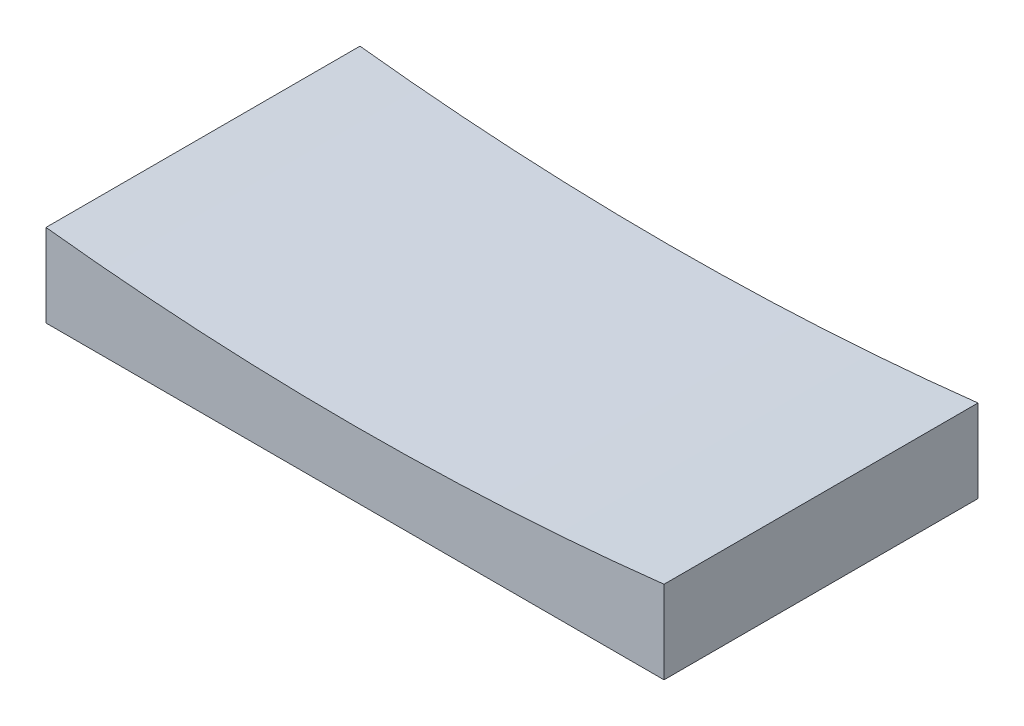
ISO-10303-21;
HEADER;
FILE_DESCRIPTION(('STEP AP214'),'2;1');
FILE_NAME('part.step','',(''),(''),'','','');
FILE_SCHEMA(('AUTOMOTIVE_DESIGN { 1 0 10303 214 1 1 1 1 }'));
ENDSEC;
DATA;
#1=APPLICATION_CONTEXT('core data for automotive mechanical design processes');
#2=APPLICATION_PROTOCOL_DEFINITION('international standard','automotive_design',2000,#1);
#3=PRODUCT_CONTEXT('',#1,'mechanical');
#4=PRODUCT('Part','Part','',(#3));
#5=PRODUCT_RELATED_PRODUCT_CATEGORY('part','',(#4));
#6=PRODUCT_DEFINITION_FORMATION('','',#4);
#7=PRODUCT_DEFINITION_CONTEXT('part definition',#1,'design');
#8=PRODUCT_DEFINITION('design','',#6,#7);
#9=PRODUCT_DEFINITION_SHAPE('','',#8);
#10=(LENGTH_UNIT() NAMED_UNIT(*) SI_UNIT(.MILLI.,.METRE.));
#11=(NAMED_UNIT(*) PLANE_ANGLE_UNIT() SI_UNIT($,.RADIAN.));
#12=(NAMED_UNIT(*) SI_UNIT($,.STERADIAN.) SOLID_ANGLE_UNIT());
#13=UNCERTAINTY_MEASURE_WITH_UNIT(LENGTH_MEASURE(1.E-05),#10,'distance_accuracy_value','');
#14=(GEOMETRIC_REPRESENTATION_CONTEXT(3) GLOBAL_UNCERTAINTY_ASSIGNED_CONTEXT((#13)) GLOBAL_UNIT_ASSIGNED_CONTEXT((#10,
#11,#12)) REPRESENTATION_CONTEXT('',''));
#15=CARTESIAN_POINT('',(0.,0.,0.));
#16=DIRECTION('',(0.,0.,1.));
#17=DIRECTION('',(1.,0.,0.));
#18=AXIS2_PLACEMENT_3D('',#15,#16,#17);
#19=CARTESIAN_POINT('',(-25.,6.7,-12.7));
#20=DIRECTION('',(1.,0.,0.));
#21=DIRECTION('',(0.,0.,-1.));
#22=AXIS2_PLACEMENT_3D('',#19,#20,#21);
#23=PLANE('',#22);
#24=DIRECTION('',(0.,0.,1.));
#25=VECTOR('',#24,1.);
#26=CARTESIAN_POINT('',(-25.,0.,-12.7));
#27=LINE('',#26,#25);
#28=CARTESIAN_POINT('',(-25.,0.,-12.7));
#29=VERTEX_POINT('',#28);
#30=CARTESIAN_POINT('',(-25.,0.,12.7));
#31=VERTEX_POINT('',#30);
#32=EDGE_CURVE('E91',#29,#31,#27,.T.);
#33=ORIENTED_EDGE('',*,*,#32,.T.);
#34=DIRECTION('',(0.,-1.,0.));
#35=VECTOR('',#34,1.);
#36=CARTESIAN_POINT('',(-25.,6.7,12.7));
#37=LINE('',#36,#35);
#38=CARTESIAN_POINT('',(-25.,6.7,12.7));
#39=VERTEX_POINT('',#38);
#40=EDGE_CURVE('E11',#39,#31,#37,.T.);
#41=ORIENTED_EDGE('',*,*,#40,.F.);
#42=DIRECTION('',(0.,0.,1.));
#43=VECTOR('',#42,1.);
#44=CARTESIAN_POINT('',(-25.,6.7,-12.7));
#45=LINE('',#44,#43);
#46=CARTESIAN_POINT('',(-25.,6.7,-12.7));
#47=VERTEX_POINT('',#46);
#48=EDGE_CURVE('E92',#47,#39,#45,.T.);
#49=ORIENTED_EDGE('',*,*,#48,.F.);
#50=DIRECTION('',(0.,-1.,0.));
#51=VECTOR('',#50,1.);
#52=CARTESIAN_POINT('',(-25.,6.7,-12.7));
#53=LINE('',#52,#51);
#54=EDGE_CURVE('E86',#47,#29,#53,.T.);
#55=ORIENTED_EDGE('',*,*,#54,.T.);
#56=EDGE_LOOP('',(#33,#41,#49,#55));
#57=FACE_BOUND('',#56,.T.);
#58=ADVANCED_FACE('F36',(#57),#23,.F.);
#59=CARTESIAN_POINT('',(-25.,6.7,12.7));
#60=DIRECTION('',(0.,0.,-1.));
#61=DIRECTION('',(-1.,0.,0.));
#62=AXIS2_PLACEMENT_3D('',#59,#60,#61);
#63=PLANE('',#62);
#64=DIRECTION('',(0.,-1.,0.));
#65=VECTOR('',#64,1.);
#66=CARTESIAN_POINT('',(25.,6.7,12.7));
#67=LINE('',#66,#65);
#68=CARTESIAN_POINT('',(25.,6.7,12.7));
#69=VERTEX_POINT('',#68);
#70=CARTESIAN_POINT('',(25.,0.,12.7));
#71=VERTEX_POINT('',#70);
#72=EDGE_CURVE('E44',#69,#71,#67,.T.);
#73=ORIENTED_EDGE('',*,*,#72,.F.);
#74=CARTESIAN_POINT('',(0.,225.274929943944,12.7));
#75=DIRECTION('',(0.,0.,1.));
#76=DIRECTION('',(1.,0.,0.));
#77=AXIS2_PLACEMENT_3D('',#74,#75,#76);
#78=CIRCLE('',#77,220.);
#79=EDGE_CURVE('E51',#39,#69,#78,.T.);
#80=ORIENTED_EDGE('',*,*,#79,.F.);
#81=ORIENTED_EDGE('',*,*,#40,.T.);
#82=DIRECTION('',(1.,0.,0.));
#83=VECTOR('',#82,1.);
#84=CARTESIAN_POINT('',(-25.,0.,12.7));
#85=LINE('',#84,#83);
#86=EDGE_CURVE('E77',#31,#71,#85,.T.);
#87=ORIENTED_EDGE('',*,*,#86,.T.);
#88=EDGE_LOOP('',(#73,#80,#81,#87));
#89=FACE_BOUND('',#88,.T.);
#90=ADVANCED_FACE('F104',(#89),#63,.F.);
#91=CARTESIAN_POINT('',(25.,6.7,-12.7));
#92=DIRECTION('',(-1.,0.,0.));
#93=DIRECTION('',(0.,0.,1.));
#94=AXIS2_PLACEMENT_3D('',#91,#92,#93);
#95=PLANE('',#94);
#96=DIRECTION('',(0.,0.,-1.));
#97=VECTOR('',#96,1.);
#98=CARTESIAN_POINT('',(25.,0.,-12.7));
#99=LINE('',#98,#97);
#100=CARTESIAN_POINT('',(25.,0.,-12.7));
#101=VERTEX_POINT('',#100);
#102=EDGE_CURVE('E69',#71,#101,#99,.T.);
#103=ORIENTED_EDGE('',*,*,#102,.T.);
#104=DIRECTION('',(0.,-1.,0.));
#105=VECTOR('',#104,1.);
#106=CARTESIAN_POINT('',(25.,6.7,-12.7));
#107=LINE('',#106,#105);
#108=CARTESIAN_POINT('',(25.,6.7,-12.7));
#109=VERTEX_POINT('',#108);
#110=EDGE_CURVE('E73',#109,#101,#107,.T.);
#111=ORIENTED_EDGE('',*,*,#110,.F.);
#112=DIRECTION('',(0.,0.,-1.));
#113=VECTOR('',#112,1.);
#114=CARTESIAN_POINT('',(25.,6.7,-12.7));
#115=LINE('',#114,#113);
#116=EDGE_CURVE('E94',#69,#109,#115,.T.);
#117=ORIENTED_EDGE('',*,*,#116,.F.);
#118=ORIENTED_EDGE('',*,*,#72,.T.);
#119=EDGE_LOOP('',(#103,#111,#117,#118));
#120=FACE_BOUND('',#119,.T.);
#121=ADVANCED_FACE('F71',(#120),#95,.F.);
#122=CARTESIAN_POINT('',(-25.,6.7,-12.7));
#123=DIRECTION('',(0.,0.,1.));
#124=DIRECTION('',(1.,0.,0.));
#125=AXIS2_PLACEMENT_3D('',#122,#123,#124);
#126=PLANE('',#125);
#127=ORIENTED_EDGE('',*,*,#54,.F.);
#128=CARTESIAN_POINT('',(0.,225.274929943944,-12.7));
#129=DIRECTION('',(0.,0.,1.));
#130=DIRECTION('',(1.,0.,0.));
#131=AXIS2_PLACEMENT_3D('',#128,#129,#130);
#132=CIRCLE('',#131,220.);
#133=EDGE_CURVE('E85',#109,#47,#132,.F.);
#134=ORIENTED_EDGE('',*,*,#133,.F.);
#135=ORIENTED_EDGE('',*,*,#110,.T.);
#136=DIRECTION('',(-1.,0.,0.));
#137=VECTOR('',#136,1.);
#138=CARTESIAN_POINT('',(-25.,0.,-12.7));
#139=LINE('',#138,#137);
#140=EDGE_CURVE('E76',#101,#29,#139,.T.);
#141=ORIENTED_EDGE('',*,*,#140,.T.);
#142=EDGE_LOOP('',(#127,#134,#135,#141));
#143=FACE_BOUND('',#142,.T.);
#144=ADVANCED_FACE('F82',(#143),#126,.F.);
#145=CARTESIAN_POINT('',(0.,0.,0.));
#146=DIRECTION('',(0.,1.,0.));
#147=DIRECTION('',(0.,0.,1.));
#148=AXIS2_PLACEMENT_3D('',#145,#146,#147);
#149=PLANE('',#148);
#150=ORIENTED_EDGE('',*,*,#32,.F.);
#151=ORIENTED_EDGE('',*,*,#140,.F.);
#152=ORIENTED_EDGE('',*,*,#102,.F.);
#153=ORIENTED_EDGE('',*,*,#86,.F.);
#154=EDGE_LOOP('',(#150,#151,#152,#153));
#155=FACE_BOUND('',#154,.T.);
#156=ADVANCED_FACE('F89',(#155),#149,.F.);
#157=CARTESIAN_POINT('',(0.,225.274929943944,-12.701));
#158=DIRECTION('',(0.,0.,1.));
#159=DIRECTION('',(1.,0.,0.));
#160=AXIS2_PLACEMENT_3D('',#157,#158,#159);
#161=CYLINDRICAL_SURFACE('',#160,220.);
#162=ORIENTED_EDGE('',*,*,#133,.T.);
#163=ORIENTED_EDGE('',*,*,#48,.T.);
#164=ORIENTED_EDGE('',*,*,#79,.T.);
#165=ORIENTED_EDGE('',*,*,#116,.T.);
#166=EDGE_LOOP('',(#162,#163,#164,#165));
#167=FACE_BOUND('',#166,.T.);
#168=ADVANCED_FACE('F120',(#167),#161,.F.);
#169=CLOSED_SHELL('',(#58,#90,#121,#144,#156,#168));
#170=MANIFOLD_SOLID_BREP('B2',#169);
#171=ADVANCED_BREP_SHAPE_REPRESENTATION('',(#18,#170),#14);
#172=SHAPE_DEFINITION_REPRESENTATION(#9,#171);
ENDSEC;
END-ISO-10303-21;
